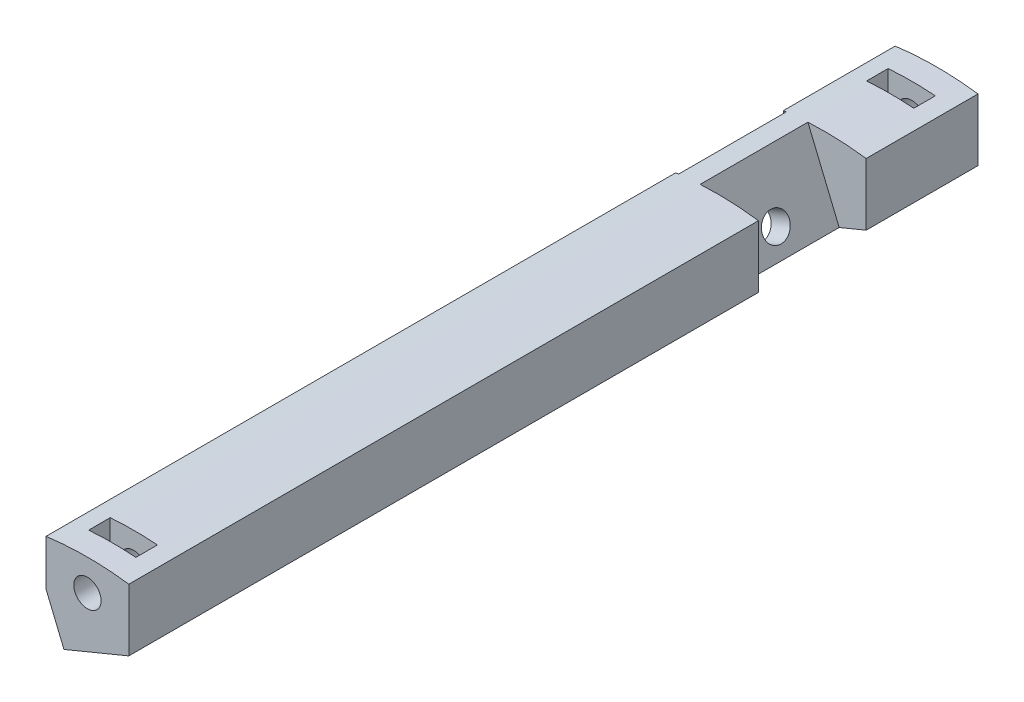
ISO-10303-21;
HEADER;
FILE_DESCRIPTION(('STEP AP214'),'2;1');
FILE_NAME('part.step','',(''),(''),'','','');
FILE_SCHEMA(('AUTOMOTIVE_DESIGN { 1 0 10303 214 1 1 1 1 }'));
ENDSEC;
DATA;
#1=APPLICATION_CONTEXT('core data for automotive mechanical design processes');
#2=APPLICATION_PROTOCOL_DEFINITION('international standard','automotive_design',2000,#1);
#3=PRODUCT_CONTEXT('',#1,'mechanical');
#4=PRODUCT('Part','Part','',(#3));
#5=PRODUCT_RELATED_PRODUCT_CATEGORY('part','',(#4));
#6=PRODUCT_DEFINITION_FORMATION('','',#4);
#7=PRODUCT_DEFINITION_CONTEXT('part definition',#1,'design');
#8=PRODUCT_DEFINITION('design','',#6,#7);
#9=PRODUCT_DEFINITION_SHAPE('','',#8);
#10=(LENGTH_UNIT() NAMED_UNIT(*) SI_UNIT(.MILLI.,.METRE.));
#11=(NAMED_UNIT(*) PLANE_ANGLE_UNIT() SI_UNIT($,.RADIAN.));
#12=(NAMED_UNIT(*) SI_UNIT($,.STERADIAN.) SOLID_ANGLE_UNIT());
#13=UNCERTAINTY_MEASURE_WITH_UNIT(LENGTH_MEASURE(1.E-05),#10,'distance_accuracy_value','');
#14=(GEOMETRIC_REPRESENTATION_CONTEXT(3) GLOBAL_UNCERTAINTY_ASSIGNED_CONTEXT((#13)) GLOBAL_UNIT_ASSIGNED_CONTEXT((#10,
#11,#12)) REPRESENTATION_CONTEXT('',''));
#15=CARTESIAN_POINT('',(0.,0.,0.));
#16=DIRECTION('',(0.,0.,1.));
#17=DIRECTION('',(1.,0.,0.));
#18=AXIS2_PLACEMENT_3D('',#15,#16,#17);
#19=CARTESIAN_POINT('',(0.,0.,102.5));
#20=DIRECTION('',(0.,0.,-1.));
#21=DIRECTION('',(-1.,0.,0.));
#22=AXIS2_PLACEMENT_3D('',#19,#20,#21);
#23=CYLINDRICAL_SURFACE('',#22,37.5);
#24=DIRECTION('',(0.,0.,-1.));
#25=VECTOR('',#24,1.);
#26=CARTESIAN_POINT('',(2.85,37.3915431615225,5.6));
#27=LINE('',#26,#25);
#28=CARTESIAN_POINT('',(2.85,37.3915431615225,5.6));
#29=VERTEX_POINT('',#28);
#30=CARTESIAN_POINT('',(2.85,37.3915431615225,3.));
#31=VERTEX_POINT('',#30);
#32=EDGE_CURVE('E373',#29,#31,#27,.T.);
#33=ORIENTED_EDGE('',*,*,#32,.F.);
#34=CARTESIAN_POINT('',(0.,0.,5.6));
#35=DIRECTION('',(0.,0.,-1.));
#36=DIRECTION('',(-1.,0.,0.));
#37=AXIS2_PLACEMENT_3D('',#34,#35,#36);
#38=CIRCLE('',#37,37.5);
#39=CARTESIAN_POINT('',(-2.85,37.3915431615225,5.6));
#40=VERTEX_POINT('',#39);
#41=EDGE_CURVE('E357',#40,#29,#38,.T.);
#42=ORIENTED_EDGE('',*,*,#41,.F.);
#43=DIRECTION('',(0.,0.,-1.));
#44=VECTOR('',#43,1.);
#45=CARTESIAN_POINT('',(-2.85,37.3915431615225,5.6));
#46=LINE('',#45,#44);
#47=CARTESIAN_POINT('',(-2.85,37.3915431615225,3.));
#48=VERTEX_POINT('',#47);
#49=EDGE_CURVE('E387',#40,#48,#46,.T.);
#50=ORIENTED_EDGE('',*,*,#49,.T.);
#51=CARTESIAN_POINT('',(0.,0.,3.));
#52=DIRECTION('',(0.,0.,-1.));
#53=DIRECTION('',(-1.,0.,0.));
#54=AXIS2_PLACEMENT_3D('',#51,#52,#53);
#55=CIRCLE('',#54,37.5);
#56=EDGE_CURVE('E352',#48,#31,#55,.T.);
#57=ORIENTED_EDGE('',*,*,#56,.T.);
#58=EDGE_LOOP('',(#33,#42,#50,#57));
#59=FACE_BOUND('',#58,.T.);
#60=DIRECTION('',(0.,0.,-1.));
#61=VECTOR('',#60,1.);
#62=CARTESIAN_POINT('',(-5.,37.1651718682963,102.5));
#63=LINE('',#62,#61);
#64=CARTESIAN_POINT('',(-5.,37.1651718682963,13.5));
#65=VERTEX_POINT('',#64);
#66=CARTESIAN_POINT('',(-5.,37.1651718682963,0.));
#67=VERTEX_POINT('',#66);
#68=EDGE_CURVE('E452',#65,#67,#63,.T.);
#69=ORIENTED_EDGE('',*,*,#68,.F.);
#70=CARTESIAN_POINT('',(0.,0.,13.5));
#71=DIRECTION('',(0.,0.,1.));
#72=DIRECTION('',(1.,0.,0.));
#73=AXIS2_PLACEMENT_3D('',#70,#71,#72);
#74=CIRCLE('',#73,37.5);
#75=CARTESIAN_POINT('',(-4.64277954221572,37.2114847610571,13.5));
#76=VERTEX_POINT('',#75);
#77=EDGE_CURVE('E303',#76,#65,#74,.T.);
#78=ORIENTED_EDGE('',*,*,#77,.F.);
#79=DIRECTION('',(0.,0.,1.));
#80=VECTOR('',#79,1.);
#81=CARTESIAN_POINT('',(-4.64277954221572,37.2114847610571,13.5));
#82=LINE('',#81,#80);
#83=CARTESIAN_POINT('',(-4.64277954221572,37.2114847610571,26.5));
#84=VERTEX_POINT('',#83);
#85=EDGE_CURVE('E311',#76,#84,#82,.T.);
#86=ORIENTED_EDGE('',*,*,#85,.T.);
#87=CARTESIAN_POINT('',(0.,0.,26.5));
#88=DIRECTION('',(0.,0.,1.));
#89=DIRECTION('',(1.,0.,0.));
#90=AXIS2_PLACEMENT_3D('',#87,#88,#89);
#91=CIRCLE('',#90,37.5);
#92=CARTESIAN_POINT('',(-5.,37.1651718682963,26.5));
#93=VERTEX_POINT('',#92);
#94=EDGE_CURVE('E314',#84,#93,#91,.T.);
#95=ORIENTED_EDGE('',*,*,#94,.T.);
#96=CARTESIAN_POINT('',(-5.,37.1651718682963,102.5));
#97=VERTEX_POINT('',#96);
#98=EDGE_CURVE('E453',#97,#93,#63,.T.);
#99=ORIENTED_EDGE('',*,*,#98,.F.);
#100=CARTESIAN_POINT('',(0.,0.,102.5));
#101=DIRECTION('',(0.,0.,1.));
#102=DIRECTION('',(1.,0.,0.));
#103=AXIS2_PLACEMENT_3D('',#100,#101,#102);
#104=CIRCLE('',#103,37.5);
#105=CARTESIAN_POINT('',(5.,37.1651718682963,102.5));
#106=VERTEX_POINT('',#105);
#107=EDGE_CURVE('E407',#97,#106,#104,.F.);
#108=ORIENTED_EDGE('',*,*,#107,.T.);
#109=DIRECTION('',(0.,0.,-1.));
#110=VECTOR('',#109,1.);
#111=CARTESIAN_POINT('',(5.,37.1651718682963,102.5));
#112=LINE('',#111,#110);
#113=CARTESIAN_POINT('',(5.,37.1651718682963,26.5));
#114=VERTEX_POINT('',#113);
#115=EDGE_CURVE('E437',#106,#114,#112,.T.);
#116=ORIENTED_EDGE('',*,*,#115,.T.);
#117=CARTESIAN_POINT('',(0.,0.,26.5));
#118=DIRECTION('',(0.,0.,1.));
#119=DIRECTION('',(1.,0.,0.));
#120=AXIS2_PLACEMENT_3D('',#117,#118,#119);
#121=CIRCLE('',#120,37.5);
#122=CARTESIAN_POINT('',(-2.03345257029292,37.444827021157,26.5));
#123=VERTEX_POINT('',#122);
#124=EDGE_CURVE('E328',#114,#123,#121,.T.);
#125=ORIENTED_EDGE('',*,*,#124,.T.);
#126=DIRECTION('',(0.,0.,1.));
#127=VECTOR('',#126,1.);
#128=CARTESIAN_POINT('',(-2.03345257029292,37.444827021157,13.5));
#129=LINE('',#128,#127);
#130=CARTESIAN_POINT('',(-2.03345257029292,37.444827021157,13.5));
#131=VERTEX_POINT('',#130);
#132=EDGE_CURVE('E350',#131,#123,#129,.T.);
#133=ORIENTED_EDGE('',*,*,#132,.F.);
#134=CARTESIAN_POINT('',(0.,0.,13.5));
#135=DIRECTION('',(0.,0.,1.));
#136=DIRECTION('',(1.,0.,0.));
#137=AXIS2_PLACEMENT_3D('',#134,#135,#136);
#138=CIRCLE('',#137,37.5);
#139=CARTESIAN_POINT('',(5.,37.1651718682963,13.5));
#140=VERTEX_POINT('',#139);
#141=EDGE_CURVE('E334',#140,#131,#138,.T.);
#142=ORIENTED_EDGE('',*,*,#141,.F.);
#143=CARTESIAN_POINT('',(5.,37.1651718682963,0.));
#144=VERTEX_POINT('',#143);
#145=EDGE_CURVE('E423',#140,#144,#112,.T.);
#146=ORIENTED_EDGE('',*,*,#145,.T.);
#147=CARTESIAN_POINT('',(0.,0.,0.));
#148=DIRECTION('',(0.,0.,1.));
#149=DIRECTION('',(1.,0.,0.));
#150=AXIS2_PLACEMENT_3D('',#147,#148,#149);
#151=CIRCLE('',#150,37.5);
#152=EDGE_CURVE('E402',#67,#144,#151,.F.);
#153=ORIENTED_EDGE('',*,*,#152,.F.);
#154=EDGE_LOOP('',(#69,#78,#86,#95,#99,#108,#116,#125,#133,#142,#146,#153));
#155=FACE_BOUND('',#154,.T.);
#156=DIRECTION('',(0.,0.,1.));
#157=VECTOR('',#156,1.);
#158=CARTESIAN_POINT('',(-2.85,37.3915431615225,96.9));
#159=LINE('',#158,#157);
#160=CARTESIAN_POINT('',(-2.85,37.3915431615225,96.9));
#161=VERTEX_POINT('',#160);
#162=CARTESIAN_POINT('',(-2.85,37.3915431615225,99.5));
#163=VERTEX_POINT('',#162);
#164=EDGE_CURVE('E263',#161,#163,#159,.T.);
#165=ORIENTED_EDGE('',*,*,#164,.F.);
#166=CARTESIAN_POINT('',(0.,0.,96.9));
#167=DIRECTION('',(0.,0.,1.));
#168=DIRECTION('',(1.,0.,0.));
#169=AXIS2_PLACEMENT_3D('',#166,#167,#168);
#170=CIRCLE('',#169,37.5);
#171=CARTESIAN_POINT('',(2.85,37.3915431615225,96.9));
#172=VERTEX_POINT('',#171);
#173=EDGE_CURVE('E270',#172,#161,#170,.T.);
#174=ORIENTED_EDGE('',*,*,#173,.F.);
#175=DIRECTION('',(0.,0.,1.));
#176=VECTOR('',#175,1.);
#177=CARTESIAN_POINT('',(2.85,37.3915431615225,96.9));
#178=LINE('',#177,#176);
#179=CARTESIAN_POINT('',(2.85,37.3915431615225,99.5));
#180=VERTEX_POINT('',#179);
#181=EDGE_CURVE('E481',#172,#180,#178,.T.);
#182=ORIENTED_EDGE('',*,*,#181,.T.);
#183=CARTESIAN_POINT('',(0.,0.,99.5));
#184=DIRECTION('',(0.,0.,1.));
#185=DIRECTION('',(1.,0.,0.));
#186=AXIS2_PLACEMENT_3D('',#183,#184,#185);
#187=CIRCLE('',#186,37.5);
#188=EDGE_CURVE('E283',#180,#163,#187,.T.);
#189=ORIENTED_EDGE('',*,*,#188,.T.);
#190=EDGE_LOOP('',(#165,#174,#182,#189));
#191=FACE_BOUND('',#190,.T.);
#192=ADVANCED_FACE('F77',(#59,#155,#191),#23,.T.);
#193=CARTESIAN_POINT('',(-9.74398788114535,23.5705545307802,102.5));
#194=DIRECTION('',(0.382038938739746,-0.924146227220892,0.));
#195=DIRECTION('',(0.924146227220892,0.382038938739746,0.));
#196=AXIS2_PLACEMENT_3D('',#193,#194,#195);
#197=PLANE('',#196);
#198=DIRECTION('',(0.924146227220892,0.382038938739746,0.));
#199=VECTOR('',#198,1.);
#200=CARTESIAN_POINT('',(-9.74398788114535,23.5705545307802,13.5));
#201=LINE('',#200,#199);
#202=CARTESIAN_POINT('',(-0.564385746059894,27.3653711457734,13.5));
#203=VERTEX_POINT('',#202);
#204=CARTESIAN_POINT('',(5.,29.6656694779498,13.5));
#205=VERTEX_POINT('',#204);
#206=EDGE_CURVE('E330',#203,#205,#201,.T.);
#207=ORIENTED_EDGE('',*,*,#206,.F.);
#208=DIRECTION('',(0.,0.,-1.));
#209=VECTOR('',#208,1.);
#210=CARTESIAN_POINT('',(-0.564385746093131,27.3653711457597,13.5));
#211=LINE('',#210,#209);
#212=CARTESIAN_POINT('',(-0.564385746093132,27.3653711457597,11.));
#213=VERTEX_POINT('',#212);
#214=EDGE_CURVE('E102',#203,#213,#211,.T.);
#215=ORIENTED_EDGE('',*,*,#214,.T.);
#216=DIRECTION('',(-0.924146227220892,-0.382038938739746,0.));
#217=VECTOR('',#216,1.);
#218=CARTESIAN_POINT('',(-9.74398788114535,23.5705545307802,11.));
#219=LINE('',#218,#217);
#220=CARTESIAN_POINT('',(-2.83353083101524,26.4273142078472,11.));
#221=VERTEX_POINT('',#220);
#222=EDGE_CURVE('E474',#213,#221,#219,.T.);
#223=ORIENTED_EDGE('',*,*,#222,.T.);
#224=DIRECTION('',(0.,0.,-1.));
#225=VECTOR('',#224,1.);
#226=CARTESIAN_POINT('',(-2.83353083101524,26.4273142078472,102.5));
#227=LINE('',#226,#225);
#228=CARTESIAN_POINT('',(-2.83353083101524,26.4273142078472,0.));
#229=VERTEX_POINT('',#228);
#230=EDGE_CURVE('E444',#221,#229,#227,.T.);
#231=ORIENTED_EDGE('',*,*,#230,.T.);
#232=DIRECTION('',(-0.924146227220892,-0.382038938739746,0.));
#233=VECTOR('',#232,1.);
#234=CARTESIAN_POINT('',(-9.74398788114535,23.5705545307802,0.));
#235=LINE('',#234,#233);
#236=CARTESIAN_POINT('',(5.,29.6656694779498,0.));
#237=VERTEX_POINT('',#236);
#238=EDGE_CURVE('E432',#237,#229,#235,.T.);
#239=ORIENTED_EDGE('',*,*,#238,.F.);
#240=DIRECTION('',(0.,0.,-1.));
#241=VECTOR('',#240,1.);
#242=CARTESIAN_POINT('',(5.,29.6656694779498,102.5));
#243=LINE('',#242,#241);
#244=EDGE_CURVE('E440',#205,#237,#243,.T.);
#245=ORIENTED_EDGE('',*,*,#244,.F.);
#246=EDGE_LOOP('',(#207,#215,#223,#231,#239,#245));
#247=FACE_BOUND('',#246,.T.);
#248=ADVANCED_FACE('F520',(#247),#197,.T.);
#249=CARTESIAN_POINT('',(-5.,0.,102.5));
#250=DIRECTION('',(-1.,0.,0.));
#251=DIRECTION('',(0.,0.,1.));
#252=AXIS2_PLACEMENT_3D('',#249,#250,#251);
#253=PLANE('',#252);
#254=DIRECTION('',(0.,0.,-1.));
#255=VECTOR('',#254,1.);
#256=CARTESIAN_POINT('',(-5.,31.6576334580734,102.5));
#257=LINE('',#256,#255);
#258=CARTESIAN_POINT('',(-5.,31.6576334580734,13.5));
#259=VERTEX_POINT('',#258);
#260=CARTESIAN_POINT('',(-5.,31.6576334580734,0.));
#261=VERTEX_POINT('',#260);
#262=EDGE_CURVE('E448',#259,#261,#257,.T.);
#263=ORIENTED_EDGE('',*,*,#262,.F.);
#264=DIRECTION('',(0.,-1.,0.));
#265=VECTOR('',#264,1.);
#266=CARTESIAN_POINT('',(-5.,0.,13.5));
#267=LINE('',#266,#265);
#268=EDGE_CURVE('E306',#65,#259,#267,.T.);
#269=ORIENTED_EDGE('',*,*,#268,.F.);
#270=ORIENTED_EDGE('',*,*,#68,.T.);
#271=DIRECTION('',(0.,1.,0.));
#272=VECTOR('',#271,1.);
#273=CARTESIAN_POINT('',(-5.,0.,0.));
#274=LINE('',#273,#272);
#275=EDGE_CURVE('E426',#261,#67,#274,.T.);
#276=ORIENTED_EDGE('',*,*,#275,.F.);
#277=EDGE_LOOP('',(#263,#269,#270,#276));
#278=FACE_BOUND('',#277,.T.);
#279=ADVANCED_FACE('F528',(#278),#253,.T.);
#280=CARTESIAN_POINT('',(6.92489669429458,2.86838612880943,102.5));
#281=DIRECTION('',(-0.923879532511286,-0.382683432365091,0.));
#282=DIRECTION('',(0.382683432365091,-0.923879532511287,0.));
#283=AXIS2_PLACEMENT_3D('',#280,#281,#282);
#284=PLANE('',#283);
#285=ORIENTED_EDGE('',*,*,#230,.F.);
#286=DIRECTION('',(0.27059808298446,-0.653281561893243,-0.707106695185005));
#287=VECTOR('',#286,1.);
#288=CARTESIAN_POINT('',(-15.4620829121985,56.9153359153747,43.999988871355));
#289=LINE('',#288,#287);
#290=CARTESIAN_POINT('',(-3.79023964464647,28.7370136009576,13.5));
#291=VERTEX_POINT('',#290);
#292=EDGE_CURVE('E477',#221,#291,#289,.F.);
#293=ORIENTED_EDGE('',*,*,#292,.T.);
#294=DIRECTION('',(0.382683432365091,-0.923879532511286,0.));
#295=VECTOR('',#294,1.);
#296=CARTESIAN_POINT('',(6.92489669429458,2.86838612880943,13.5));
#297=LINE('',#296,#295);
#298=EDGE_CURVE('E308',#259,#291,#297,.T.);
#299=ORIENTED_EDGE('',*,*,#298,.F.);
#300=ORIENTED_EDGE('',*,*,#262,.T.);
#301=DIRECTION('',(-0.382683432365091,0.923879532511286,0.));
#302=VECTOR('',#301,1.);
#303=CARTESIAN_POINT('',(6.92489669429458,2.86838612880943,0.));
#304=LINE('',#303,#302);
#305=EDGE_CURVE('E429',#229,#261,#304,.T.);
#306=ORIENTED_EDGE('',*,*,#305,.F.);
#307=EDGE_LOOP('',(#285,#293,#299,#300,#306));
#308=FACE_BOUND('',#307,.T.);
#309=ADVANCED_FACE('F615',(#308),#284,.T.);
#310=CARTESIAN_POINT('',(-2.83353083101524,26.4273142078472,102.5));
#311=VERTEX_POINT('',#310);
#312=CARTESIAN_POINT('',(-2.83353083101524,26.4273142078472,29.));
#313=VERTEX_POINT('',#312);
#314=EDGE_CURVE('E445',#311,#313,#227,.T.);
#315=ORIENTED_EDGE('',*,*,#314,.T.);
#316=DIRECTION('',(0.924146227220892,0.382038938739746,0.));
#317=VECTOR('',#316,1.);
#318=CARTESIAN_POINT('',(-0.564385746059894,27.3653711457734,29.));
#319=LINE('',#318,#317);
#320=CARTESIAN_POINT('',(-0.564385746093132,27.3653711457597,29.));
#321=VERTEX_POINT('',#320);
#322=EDGE_CURVE('E464',#313,#321,#319,.T.);
#323=ORIENTED_EDGE('',*,*,#322,.T.);
#324=DIRECTION('',(0.,0.,-1.));
#325=VECTOR('',#324,1.);
#326=CARTESIAN_POINT('',(-0.564385746093131,27.3653711457597,13.5));
#327=LINE('',#326,#325);
#328=CARTESIAN_POINT('',(-0.564385746059894,27.3653711457734,26.5));
#329=VERTEX_POINT('',#328);
#330=EDGE_CURVE('E456',#321,#329,#327,.T.);
#331=ORIENTED_EDGE('',*,*,#330,.T.);
#332=DIRECTION('',(0.924146227220892,0.382038938739746,0.));
#333=VECTOR('',#332,1.);
#334=CARTESIAN_POINT('',(-9.74398788114535,23.5705545307802,26.5));
#335=LINE('',#334,#333);
#336=CARTESIAN_POINT('',(5.,29.6656694779498,26.5));
#337=VERTEX_POINT('',#336);
#338=EDGE_CURVE('E342',#329,#337,#335,.T.);
#339=ORIENTED_EDGE('',*,*,#338,.T.);
#340=CARTESIAN_POINT('',(5.,29.6656694779498,102.5));
#341=VERTEX_POINT('',#340);
#342=EDGE_CURVE('E441',#341,#337,#243,.T.);
#343=ORIENTED_EDGE('',*,*,#342,.F.);
#344=DIRECTION('',(-0.924146227220892,-0.382038938739746,0.));
#345=VECTOR('',#344,1.);
#346=CARTESIAN_POINT('',(-9.74398788114535,23.5705545307802,102.5));
#347=LINE('',#346,#345);
#348=EDGE_CURVE('E417',#341,#311,#347,.T.);
#349=ORIENTED_EDGE('',*,*,#348,.T.);
#350=EDGE_LOOP('',(#315,#323,#331,#339,#343,#349));
#351=FACE_BOUND('',#350,.T.);
#352=ADVANCED_FACE('F531',(#351),#197,.T.);
#353=CARTESIAN_POINT('',(5.,0.,102.5));
#354=DIRECTION('',(1.,0.,0.));
#355=DIRECTION('',(0.,1.,0.));
#356=AXIS2_PLACEMENT_3D('',#353,#354,#355);
#357=PLANE('',#356);
#358=ORIENTED_EDGE('',*,*,#145,.F.);
#359=DIRECTION('',(0.,1.,0.));
#360=VECTOR('',#359,1.);
#361=CARTESIAN_POINT('',(5.,0.,13.5));
#362=LINE('',#361,#360);
#363=EDGE_CURVE('E332',#205,#140,#362,.T.);
#364=ORIENTED_EDGE('',*,*,#363,.F.);
#365=ORIENTED_EDGE('',*,*,#244,.T.);
#366=DIRECTION('',(0.,-1.,0.));
#367=VECTOR('',#366,1.);
#368=CARTESIAN_POINT('',(5.,0.,0.));
#369=LINE('',#368,#367);
#370=EDGE_CURVE('E411',#144,#237,#369,.T.);
#371=ORIENTED_EDGE('',*,*,#370,.F.);
#372=EDGE_LOOP('',(#358,#364,#365,#371));
#373=FACE_BOUND('',#372,.T.);
#374=ADVANCED_FACE('F598',(#373),#357,.T.);
#375=DIRECTION('',(0.,-1.,0.));
#376=VECTOR('',#375,1.);
#377=CARTESIAN_POINT('',(-5.,0.,26.5));
#378=LINE('',#377,#376);
#379=CARTESIAN_POINT('',(-5.,31.6576334580734,26.5));
#380=VERTEX_POINT('',#379);
#381=EDGE_CURVE('E317',#93,#380,#378,.T.);
#382=ORIENTED_EDGE('',*,*,#381,.T.);
#383=CARTESIAN_POINT('',(-5.,31.6576334580734,102.5));
#384=VERTEX_POINT('',#383);
#385=EDGE_CURVE('E449',#384,#380,#257,.T.);
#386=ORIENTED_EDGE('',*,*,#385,.F.);
#387=DIRECTION('',(0.,1.,0.));
#388=VECTOR('',#387,1.);
#389=CARTESIAN_POINT('',(-5.,0.,102.5));
#390=LINE('',#389,#388);
#391=EDGE_CURVE('E410',#384,#97,#390,.T.);
#392=ORIENTED_EDGE('',*,*,#391,.T.);
#393=ORIENTED_EDGE('',*,*,#98,.T.);
#394=EDGE_LOOP('',(#382,#386,#392,#393));
#395=FACE_BOUND('',#394,.T.);
#396=ADVANCED_FACE('F535',(#395),#253,.T.);
#397=DIRECTION('',(0.382683432365091,-0.923879532511286,0.));
#398=VECTOR('',#397,1.);
#399=CARTESIAN_POINT('',(6.92489669429458,2.86838612880943,26.5));
#400=LINE('',#399,#398);
#401=CARTESIAN_POINT('',(-3.79023964464648,28.7370136009576,26.5));
#402=VERTEX_POINT('',#401);
#403=EDGE_CURVE('E304',#380,#402,#400,.T.);
#404=ORIENTED_EDGE('',*,*,#403,.T.);
#405=DIRECTION('',(0.270598082984461,-0.653281561893244,0.707106695185004));
#406=VECTOR('',#405,1.);
#407=CARTESIAN_POINT('',(16.1093002579206,-19.3047255168043,78.4999910605958));
#408=LINE('',#407,#406);
#409=EDGE_CURVE('E469',#402,#313,#408,.T.);
#410=ORIENTED_EDGE('',*,*,#409,.T.);
#411=ORIENTED_EDGE('',*,*,#314,.F.);
#412=DIRECTION('',(-0.382683432365091,0.923879532511286,0.));
#413=VECTOR('',#412,1.);
#414=CARTESIAN_POINT('',(6.92489669429458,2.86838612880943,102.5));
#415=LINE('',#414,#413);
#416=EDGE_CURVE('E414',#311,#384,#415,.T.);
#417=ORIENTED_EDGE('',*,*,#416,.T.);
#418=ORIENTED_EDGE('',*,*,#385,.T.);
#419=EDGE_LOOP('',(#404,#410,#411,#417,#418));
#420=FACE_BOUND('',#419,.T.);
#421=ADVANCED_FACE('F558',(#420),#284,.T.);
#422=DIRECTION('',(0.,1.,0.));
#423=VECTOR('',#422,1.);
#424=CARTESIAN_POINT('',(5.,0.,26.5));
#425=LINE('',#424,#423);
#426=EDGE_CURVE('E345',#337,#114,#425,.T.);
#427=ORIENTED_EDGE('',*,*,#426,.T.);
#428=ORIENTED_EDGE('',*,*,#115,.F.);
#429=DIRECTION('',(0.,-1.,0.));
#430=VECTOR('',#429,1.);
#431=CARTESIAN_POINT('',(5.,0.,102.5));
#432=LINE('',#431,#430);
#433=EDGE_CURVE('E420',#106,#341,#432,.T.);
#434=ORIENTED_EDGE('',*,*,#433,.T.);
#435=ORIENTED_EDGE('',*,*,#342,.T.);
#436=EDGE_LOOP('',(#427,#428,#434,#435));
#437=FACE_BOUND('',#436,.T.);
#438=ADVANCED_FACE('F568',(#437),#357,.T.);
#439=CARTESIAN_POINT('',(0.,0.,102.5));
#440=DIRECTION('',(0.,0.,1.));
#441=DIRECTION('',(1.,0.,0.));
#442=AXIS2_PLACEMENT_3D('',#439,#440,#441);
#443=PLANE('',#442);
#444=CARTESIAN_POINT('',(0.,33.75,102.5));
#445=DIRECTION('',(0.,0.,1.));
#446=DIRECTION('',(1.,0.,0.));
#447=AXIS2_PLACEMENT_3D('',#444,#445,#446);
#448=CIRCLE('',#447,1.65);
#449=CARTESIAN_POINT('',(1.65,33.75,102.5));
#450=VERTEX_POINT('',#449);
#451=EDGE_CURVE('E295',#450,#450,#448,.T.);
#452=ORIENTED_EDGE('',*,*,#451,.F.);
#453=EDGE_LOOP('',(#452));
#454=FACE_BOUND('',#453,.T.);
#455=ORIENTED_EDGE('',*,*,#107,.F.);
#456=ORIENTED_EDGE('',*,*,#391,.F.);
#457=ORIENTED_EDGE('',*,*,#416,.F.);
#458=ORIENTED_EDGE('',*,*,#348,.F.);
#459=ORIENTED_EDGE('',*,*,#433,.F.);
#460=EDGE_LOOP('',(#455,#456,#457,#458,#459));
#461=FACE_BOUND('',#460,.T.);
#462=ADVANCED_FACE('F565',(#454,#461),#443,.T.);
#463=CARTESIAN_POINT('',(0.,0.,0.));
#464=DIRECTION('',(0.,0.,1.));
#465=DIRECTION('',(1.,0.,0.));
#466=AXIS2_PLACEMENT_3D('',#463,#464,#465);
#467=PLANE('',#466);
#468=CARTESIAN_POINT('',(0.,33.75,0.));
#469=DIRECTION('',(0.,0.,-1.));
#470=DIRECTION('',(-1.,0.,0.));
#471=AXIS2_PLACEMENT_3D('',#468,#469,#470);
#472=CIRCLE('',#471,1.75);
#473=CARTESIAN_POINT('',(-1.75,33.75,0.));
#474=VERTEX_POINT('',#473);
#475=EDGE_CURVE('E403',#474,#474,#472,.T.);
#476=ORIENTED_EDGE('',*,*,#475,.F.);
#477=EDGE_LOOP('',(#476));
#478=FACE_BOUND('',#477,.T.);
#479=ORIENTED_EDGE('',*,*,#152,.T.);
#480=ORIENTED_EDGE('',*,*,#370,.T.);
#481=ORIENTED_EDGE('',*,*,#238,.T.);
#482=ORIENTED_EDGE('',*,*,#305,.T.);
#483=ORIENTED_EDGE('',*,*,#275,.T.);
#484=EDGE_LOOP('',(#479,#480,#481,#482,#483));
#485=FACE_BOUND('',#484,.T.);
#486=ADVANCED_FACE('F604',(#478,#485),#467,.F.);
#487=CARTESIAN_POINT('',(0.,33.75,11.5));
#488=DIRECTION('',(0.,0.,-1.));
#489=DIRECTION('',(-1.,0.,0.));
#490=AXIS2_PLACEMENT_3D('',#487,#488,#489);
#491=CYLINDRICAL_SURFACE('',#490,1.75);
#492=CARTESIAN_POINT('',(0.,33.75,3.));
#493=DIRECTION('',(0.,0.,-1.));
#494=DIRECTION('',(-1.,0.,0.));
#495=AXIS2_PLACEMENT_3D('',#492,#493,#494);
#496=CIRCLE('',#495,1.75);
#497=CARTESIAN_POINT('',(-1.75,33.75,3.));
#498=VERTEX_POINT('',#497);
#499=EDGE_CURVE('E390',#498,#498,#496,.F.);
#500=ORIENTED_EDGE('',*,*,#499,.T.);
#501=EDGE_LOOP('',(#500));
#502=FACE_BOUND('',#501,.T.);
#503=ORIENTED_EDGE('',*,*,#475,.T.);
#504=EDGE_LOOP('',(#503));
#505=FACE_BOUND('',#504,.T.);
#506=ADVANCED_FACE('F638',(#502,#505),#491,.F.);
#507=CARTESIAN_POINT('',(0.,0.,5.6));
#508=DIRECTION('',(0.,0.,-1.));
#509=DIRECTION('',(-1.,0.,0.));
#510=AXIS2_PLACEMENT_3D('',#507,#508,#509);
#511=PLANE('',#510);
#512=ORIENTED_EDGE('',*,*,#41,.T.);
#513=DIRECTION('',(0.,-1.,0.));
#514=VECTOR('',#513,1.);
#515=CARTESIAN_POINT('',(2.85,37.3915431615225,5.6));
#516=LINE('',#515,#514);
#517=CARTESIAN_POINT('',(2.85,31.9954482671904,5.6));
#518=VERTEX_POINT('',#517);
#519=EDGE_CURVE('E360',#29,#518,#516,.T.);
#520=ORIENTED_EDGE('',*,*,#519,.T.);
#521=DIRECTION('',(-0.866025403784438,-0.500000000000001,0.));
#522=VECTOR('',#521,1.);
#523=CARTESIAN_POINT('',(2.85,31.9954482671904,5.6));
#524=LINE('',#523,#522);
#525=CARTESIAN_POINT('',(0.,30.35,5.6));
#526=VERTEX_POINT('',#525);
#527=EDGE_CURVE('E364',#518,#526,#524,.T.);
#528=ORIENTED_EDGE('',*,*,#527,.T.);
#529=DIRECTION('',(-0.866025403784438,0.500000000000001,0.));
#530=VECTOR('',#529,1.);
#531=CARTESIAN_POINT('',(0.,30.35,5.6));
#532=LINE('',#531,#530);
#533=CARTESIAN_POINT('',(-2.85,31.9954482671904,5.6));
#534=VERTEX_POINT('',#533);
#535=EDGE_CURVE('E367',#526,#534,#532,.T.);
#536=ORIENTED_EDGE('',*,*,#535,.T.);
#537=DIRECTION('',(0.,1.,0.));
#538=VECTOR('',#537,1.);
#539=CARTESIAN_POINT('',(-2.85,31.9954482671904,5.6));
#540=LINE('',#539,#538);
#541=EDGE_CURVE('E370',#534,#40,#540,.T.);
#542=ORIENTED_EDGE('',*,*,#541,.T.);
#543=EDGE_LOOP('',(#512,#520,#528,#536,#542));
#544=FACE_BOUND('',#543,.T.);
#545=CARTESIAN_POINT('',(0.,33.75,5.6));
#546=DIRECTION('',(0.,0.,-1.));
#547=DIRECTION('',(-1.,0.,0.));
#548=AXIS2_PLACEMENT_3D('',#545,#546,#547);
#549=CIRCLE('',#548,1.75);
#550=CARTESIAN_POINT('',(-1.75,33.75,5.6));
#551=VERTEX_POINT('',#550);
#552=EDGE_CURVE('E406',#551,#551,#549,.F.);
#553=ORIENTED_EDGE('',*,*,#552,.T.);
#554=EDGE_LOOP('',(#553));
#555=FACE_BOUND('',#554,.T.);
#556=ADVANCED_FACE('F645',(#544,#555),#511,.T.);
#557=CARTESIAN_POINT('',(0.,0.,3.));
#558=DIRECTION('',(0.,0.,-1.));
#559=DIRECTION('',(-1.,0.,0.));
#560=AXIS2_PLACEMENT_3D('',#557,#558,#559);
#561=PLANE('',#560);
#562=ORIENTED_EDGE('',*,*,#56,.F.);
#563=DIRECTION('',(0.,1.,0.));
#564=VECTOR('',#563,1.);
#565=CARTESIAN_POINT('',(-2.85,31.9954482671904,3.));
#566=LINE('',#565,#564);
#567=CARTESIAN_POINT('',(-2.85,31.9954482671904,3.));
#568=VERTEX_POINT('',#567);
#569=EDGE_CURVE('E361',#568,#48,#566,.T.);
#570=ORIENTED_EDGE('',*,*,#569,.F.);
#571=DIRECTION('',(-0.866025403784438,0.500000000000001,0.));
#572=VECTOR('',#571,1.);
#573=CARTESIAN_POINT('',(0.,30.35,3.));
#574=LINE('',#573,#572);
#575=CARTESIAN_POINT('',(0.,30.35,3.));
#576=VERTEX_POINT('',#575);
#577=EDGE_CURVE('E382',#576,#568,#574,.T.);
#578=ORIENTED_EDGE('',*,*,#577,.F.);
#579=DIRECTION('',(-0.866025403784438,-0.500000000000001,0.));
#580=VECTOR('',#579,1.);
#581=CARTESIAN_POINT('',(2.85,31.9954482671904,3.));
#582=LINE('',#581,#580);
#583=CARTESIAN_POINT('',(2.85,31.9954482671904,3.));
#584=VERTEX_POINT('',#583);
#585=EDGE_CURVE('E379',#584,#576,#582,.T.);
#586=ORIENTED_EDGE('',*,*,#585,.F.);
#587=DIRECTION('',(0.,-1.,0.));
#588=VECTOR('',#587,1.);
#589=CARTESIAN_POINT('',(2.85,37.3915431615225,3.));
#590=LINE('',#589,#588);
#591=EDGE_CURVE('E376',#31,#584,#590,.T.);
#592=ORIENTED_EDGE('',*,*,#591,.F.);
#593=EDGE_LOOP('',(#562,#570,#578,#586,#592));
#594=FACE_BOUND('',#593,.T.);
#595=ORIENTED_EDGE('',*,*,#499,.F.);
#596=EDGE_LOOP('',(#595));
#597=FACE_BOUND('',#596,.T.);
#598=ADVANCED_FACE('F667',(#594,#597),#561,.F.);
#599=CARTESIAN_POINT('',(-2.85,31.9954482671904,5.6));
#600=DIRECTION('',(-1.,0.,0.));
#601=DIRECTION('',(0.,0.,1.));
#602=AXIS2_PLACEMENT_3D('',#599,#600,#601);
#603=PLANE('',#602);
#604=ORIENTED_EDGE('',*,*,#569,.T.);
#605=ORIENTED_EDGE('',*,*,#49,.F.);
#606=ORIENTED_EDGE('',*,*,#541,.F.);
#607=DIRECTION('',(0.,0.,-1.));
#608=VECTOR('',#607,1.);
#609=CARTESIAN_POINT('',(-2.85,31.9954482671904,5.6));
#610=LINE('',#609,#608);
#611=EDGE_CURVE('E391',#534,#568,#610,.T.);
#612=ORIENTED_EDGE('',*,*,#611,.T.);
#613=EDGE_LOOP('',(#604,#605,#606,#612));
#614=FACE_BOUND('',#613,.T.);
#615=ADVANCED_FACE('F663',(#614),#603,.F.);
#616=CARTESIAN_POINT('',(0.,30.35,5.6));
#617=DIRECTION('',(-0.500000000000001,-0.866025403784438,0.));
#618=DIRECTION('',(0.866025403784438,-0.500000000000001,0.));
#619=AXIS2_PLACEMENT_3D('',#616,#617,#618);
#620=PLANE('',#619);
#621=ORIENTED_EDGE('',*,*,#577,.T.);
#622=ORIENTED_EDGE('',*,*,#611,.F.);
#623=ORIENTED_EDGE('',*,*,#535,.F.);
#624=DIRECTION('',(0.,0.,-1.));
#625=VECTOR('',#624,1.);
#626=CARTESIAN_POINT('',(0.,30.35,5.6));
#627=LINE('',#626,#625);
#628=EDGE_CURVE('E393',#526,#576,#627,.T.);
#629=ORIENTED_EDGE('',*,*,#628,.T.);
#630=EDGE_LOOP('',(#621,#622,#623,#629));
#631=FACE_BOUND('',#630,.T.);
#632=ADVANCED_FACE('F659',(#631),#620,.F.);
#633=CARTESIAN_POINT('',(2.85,31.9954482671904,5.6));
#634=DIRECTION('',(0.500000000000001,-0.866025403784438,0.));
#635=DIRECTION('',(0.866025403784438,0.500000000000001,0.));
#636=AXIS2_PLACEMENT_3D('',#633,#634,#635);
#637=PLANE('',#636);
#638=ORIENTED_EDGE('',*,*,#585,.T.);
#639=ORIENTED_EDGE('',*,*,#628,.F.);
#640=ORIENTED_EDGE('',*,*,#527,.F.);
#641=DIRECTION('',(0.,0.,-1.));
#642=VECTOR('',#641,1.);
#643=CARTESIAN_POINT('',(2.85,31.9954482671904,5.6));
#644=LINE('',#643,#642);
#645=EDGE_CURVE('E395',#518,#584,#644,.T.);
#646=ORIENTED_EDGE('',*,*,#645,.T.);
#647=EDGE_LOOP('',(#638,#639,#640,#646));
#648=FACE_BOUND('',#647,.T.);
#649=ADVANCED_FACE('F655',(#648),#637,.F.);
#650=CARTESIAN_POINT('',(2.85,37.3915431615225,5.6));
#651=DIRECTION('',(1.,0.,0.));
#652=DIRECTION('',(0.,0.,-1.));
#653=AXIS2_PLACEMENT_3D('',#650,#651,#652);
#654=PLANE('',#653);
#655=ORIENTED_EDGE('',*,*,#591,.T.);
#656=ORIENTED_EDGE('',*,*,#645,.F.);
#657=ORIENTED_EDGE('',*,*,#519,.F.);
#658=ORIENTED_EDGE('',*,*,#32,.T.);
#659=EDGE_LOOP('',(#655,#656,#657,#658));
#660=FACE_BOUND('',#659,.T.);
#661=ADVANCED_FACE('F651',(#660),#654,.F.);
#662=CARTESIAN_POINT('',(0.,33.75,11.5));
#663=DIRECTION('',(0.,0.,-1.));
#664=DIRECTION('',(-1.,0.,0.));
#665=AXIS2_PLACEMENT_3D('',#662,#663,#664);
#666=PLANE('',#665);
#667=CARTESIAN_POINT('',(0.,33.75,11.5));
#668=DIRECTION('',(0.,0.,-1.));
#669=DIRECTION('',(-1.,0.,0.));
#670=AXIS2_PLACEMENT_3D('',#667,#668,#669);
#671=CIRCLE('',#670,1.75);
#672=CARTESIAN_POINT('',(-1.75,33.75,11.5));
#673=VERTEX_POINT('',#672);
#674=EDGE_CURVE('E399',#673,#673,#671,.T.);
#675=ORIENTED_EDGE('',*,*,#674,.T.);
#676=EDGE_LOOP('',(#675));
#677=FACE_BOUND('',#676,.T.);
#678=ADVANCED_FACE('F648',(#677),#666,.T.);
#679=ORIENTED_EDGE('',*,*,#674,.F.);
#680=EDGE_LOOP('',(#679));
#681=FACE_BOUND('',#680,.T.);
#682=ORIENTED_EDGE('',*,*,#552,.F.);
#683=EDGE_LOOP('',(#682));
#684=FACE_BOUND('',#683,.T.);
#685=ADVANCED_FACE('F647',(#681,#684),#491,.F.);
#686=CARTESIAN_POINT('',(11.5030852175246,4.76473390623218,13.5));
#687=DIRECTION('',(0.923879532511286,0.382683432365091,0.));
#688=DIRECTION('',(-0.382683432365091,0.923879532511286,0.));
#689=AXIS2_PLACEMENT_3D('',#686,#687,#688);
#690=PLANE('',#689);
#691=CARTESIAN_POINT('',(0.597930086858205,31.0921073224695,20.));
#692=DIRECTION('',(0.923879532511286,0.382683432365091,0.));
#693=DIRECTION('',(-0.382683432365091,0.923879532511286,0.));
#694=AXIS2_PLACEMENT_3D('',#691,#692,#693);
#695=CIRCLE('',#694,1.625);
#696=CARTESIAN_POINT('',(-0.0239304907350699,32.5934115628003,20.));
#697=VERTEX_POINT('',#696);
#698=EDGE_CURVE('E294',#697,#697,#695,.T.);
#699=ORIENTED_EDGE('',*,*,#698,.F.);
#700=EDGE_LOOP('',(#699));
#701=FACE_BOUND('',#700,.T.);
#702=DIRECTION('',(-0.382683432365091,0.923879532511286,0.));
#703=VECTOR('',#702,1.);
#704=CARTESIAN_POINT('',(11.5030852175246,4.76473390623218,26.5));
#705=LINE('',#704,#703);
#706=CARTESIAN_POINT('',(1.74578896431224,28.3209308528296,26.5));
#707=VERTEX_POINT('',#706);
#708=EDGE_CURVE('E324',#707,#123,#705,.T.);
#709=ORIENTED_EDGE('',*,*,#708,.F.);
#710=DIRECTION('',(0.,0.,1.));
#711=VECTOR('',#710,1.);
#712=CARTESIAN_POINT('',(1.74578896431224,28.3209308528296,13.5));
#713=LINE('',#712,#711);
#714=CARTESIAN_POINT('',(1.74578896431224,28.3209308528296,13.5));
#715=VERTEX_POINT('',#714);
#716=EDGE_CURVE('E337',#715,#707,#713,.T.);
#717=ORIENTED_EDGE('',*,*,#716,.F.);
#718=DIRECTION('',(-0.382683432365091,0.923879532511286,0.));
#719=VECTOR('',#718,1.);
#720=CARTESIAN_POINT('',(11.5030852175246,4.76473390623218,13.5));
#721=LINE('',#720,#719);
#722=EDGE_CURVE('E325',#715,#131,#721,.T.);
#723=ORIENTED_EDGE('',*,*,#722,.T.);
#724=ORIENTED_EDGE('',*,*,#132,.T.);
#725=EDGE_LOOP('',(#709,#717,#723,#724));
#726=FACE_BOUND('',#725,.T.);
#727=ADVANCED_FACE('F589',(#701,#726),#690,.T.);
#728=CARTESIAN_POINT('',(-9.74794388039498,23.5667674812199,13.5));
#729=DIRECTION('',(0.382223835543148,-0.9240697698457,0.));
#730=DIRECTION('',(0.9240697698457,0.382223835543148,0.));
#731=AXIS2_PLACEMENT_3D('',#728,#729,#730);
#732=PLANE('',#731);
#733=DIRECTION('',(0.9240697698457,0.382223835543148,0.));
#734=VECTOR('',#733,1.);
#735=CARTESIAN_POINT('',(-9.74794388039498,23.5667674812199,26.5));
#736=LINE('',#735,#734);
#737=EDGE_CURVE('E340',#329,#707,#736,.T.);
#738=ORIENTED_EDGE('',*,*,#737,.F.);
#739=DIRECTION('',(0.,0.,1.));
#740=VECTOR('',#739,1.);
#741=CARTESIAN_POINT('',(-0.564385746059894,27.3653711457734,13.5));
#742=LINE('',#741,#740);
#743=EDGE_CURVE('E353',#203,#329,#742,.T.);
#744=ORIENTED_EDGE('',*,*,#743,.F.);
#745=DIRECTION('',(0.9240697698457,0.382223835543148,0.));
#746=VECTOR('',#745,1.);
#747=CARTESIAN_POINT('',(-9.74794388039498,23.5667674812199,13.5));
#748=LINE('',#747,#746);
#749=EDGE_CURVE('E327',#203,#715,#748,.T.);
#750=ORIENTED_EDGE('',*,*,#749,.T.);
#751=ORIENTED_EDGE('',*,*,#716,.T.);
#752=EDGE_LOOP('',(#738,#744,#750,#751));
#753=FACE_BOUND('',#752,.T.);
#754=ADVANCED_FACE('F677',(#753),#732,.T.);
#755=CARTESIAN_POINT('',(0.,0.,13.5));
#756=DIRECTION('',(0.,0.,1.));
#757=DIRECTION('',(1.,0.,0.));
#758=AXIS2_PLACEMENT_3D('',#755,#756,#757);
#759=PLANE('',#758);
#760=ORIENTED_EDGE('',*,*,#722,.F.);
#761=ORIENTED_EDGE('',*,*,#749,.F.);
#762=ORIENTED_EDGE('',*,*,#206,.T.);
#763=ORIENTED_EDGE('',*,*,#363,.T.);
#764=ORIENTED_EDGE('',*,*,#141,.T.);
#765=EDGE_LOOP('',(#760,#761,#762,#763,#764));
#766=FACE_BOUND('',#765,.T.);
#767=ADVANCED_FACE('F594',(#766),#759,.T.);
#768=CARTESIAN_POINT('',(0.,0.,26.5));
#769=DIRECTION('',(0.,0.,1.));
#770=DIRECTION('',(1.,0.,0.));
#771=AXIS2_PLACEMENT_3D('',#768,#769,#770);
#772=PLANE('',#771);
#773=ORIENTED_EDGE('',*,*,#708,.T.);
#774=ORIENTED_EDGE('',*,*,#124,.F.);
#775=ORIENTED_EDGE('',*,*,#426,.F.);
#776=ORIENTED_EDGE('',*,*,#338,.F.);
#777=ORIENTED_EDGE('',*,*,#737,.T.);
#778=EDGE_LOOP('',(#773,#774,#775,#776,#777));
#779=FACE_BOUND('',#778,.T.);
#780=ADVANCED_FACE('F583',(#779),#772,.F.);
#781=CARTESIAN_POINT('',(9.19338638624639,3.80802532531944,13.5));
#782=DIRECTION('',(0.923879532511286,0.382683432365091,0.));
#783=DIRECTION('',(-0.382683432365091,0.923879532511286,0.));
#784=AXIS2_PLACEMENT_3D('',#781,#782,#783);
#785=PLANE('',#784);
#786=CARTESIAN_POINT('',(-1.71176874442002,30.1353987415567,20.));
#787=DIRECTION('',(0.923879532511286,0.382683432365091,0.));
#788=DIRECTION('',(-0.382683432365091,0.923879532511286,0.));
#789=AXIS2_PLACEMENT_3D('',#786,#787,#788);
#790=CIRCLE('',#789,1.625);
#791=CARTESIAN_POINT('',(-2.3336293220133,31.6367029818876,20.));
#792=VERTEX_POINT('',#791);
#793=EDGE_CURVE('E300',#792,#792,#790,.T.);
#794=ORIENTED_EDGE('',*,*,#793,.T.);
#795=EDGE_LOOP('',(#794));
#796=FACE_BOUND('',#795,.T.);
#797=ORIENTED_EDGE('',*,*,#743,.T.);
#798=ORIENTED_EDGE('',*,*,#330,.F.);
#799=DIRECTION('',(-0.270598082984461,0.653281561893244,-0.707106695185005));
#800=VECTOR('',#799,1.);
#801=CARTESIAN_POINT('',(1.34870490603182,22.7467617473504,33.9991455729976));
#802=LINE('',#801,#800);
#803=CARTESIAN_POINT('',(-1.52109455972437,29.6750705388701,26.5));
#804=VERTEX_POINT('',#803);
#805=EDGE_CURVE('E87',#321,#804,#802,.T.);
#806=ORIENTED_EDGE('',*,*,#805,.T.);
#807=DIRECTION('',(-0.382683432365091,0.923879532511286,0.));
#808=VECTOR('',#807,1.);
#809=CARTESIAN_POINT('',(9.19338638624639,3.80802532531944,26.5));
#810=LINE('',#809,#808);
#811=EDGE_CURVE('E312',#804,#84,#810,.T.);
#812=ORIENTED_EDGE('',*,*,#811,.T.);
#813=ORIENTED_EDGE('',*,*,#85,.F.);
#814=DIRECTION('',(-0.382683432365091,0.923879532511286,0.));
#815=VECTOR('',#814,1.);
#816=CARTESIAN_POINT('',(9.19338638624639,3.80802532531944,13.5));
#817=LINE('',#816,#815);
#818=CARTESIAN_POINT('',(-1.52109455972437,29.6750705388701,13.5));
#819=VERTEX_POINT('',#818);
#820=EDGE_CURVE('E301',#819,#76,#817,.T.);
#821=ORIENTED_EDGE('',*,*,#820,.F.);
#822=DIRECTION('',(-0.270598082984461,0.653281561893243,0.707106695185006));
#823=VECTOR('',#822,1.);
#824=CARTESIAN_POINT('',(3.83614721640482,16.7415447860273,-0.499143991878543));
#825=LINE('',#824,#823);
#826=EDGE_CURVE('E12',#819,#213,#825,.F.);
#827=ORIENTED_EDGE('',*,*,#826,.T.);
#828=ORIENTED_EDGE('',*,*,#214,.F.);
#829=EDGE_LOOP('',(#797,#798,#806,#812,#813,#821,#827,#828));
#830=FACE_BOUND('',#829,.T.);
#831=ADVANCED_FACE('F577',(#796,#830),#785,.F.);
#832=CARTESIAN_POINT('',(0.,0.,13.5));
#833=DIRECTION('',(0.,0.,1.));
#834=DIRECTION('',(1.,0.,0.));
#835=AXIS2_PLACEMENT_3D('',#832,#833,#834);
#836=PLANE('',#835);
#837=ORIENTED_EDGE('',*,*,#298,.T.);
#838=DIRECTION('',(0.924146227220892,0.382038938739746,0.));
#839=VECTOR('',#838,1.);
#840=CARTESIAN_POINT('',(-10.6990852279947,25.8809200988324,13.5));
#841=LINE('',#840,#839);
#842=EDGE_CURVE('E471',#291,#819,#841,.T.);
#843=ORIENTED_EDGE('',*,*,#842,.T.);
#844=ORIENTED_EDGE('',*,*,#820,.T.);
#845=ORIENTED_EDGE('',*,*,#77,.T.);
#846=ORIENTED_EDGE('',*,*,#268,.T.);
#847=EDGE_LOOP('',(#837,#843,#844,#845,#846));
#848=FACE_BOUND('',#847,.T.);
#849=ADVANCED_FACE('F612',(#848),#836,.T.);
#850=CARTESIAN_POINT('',(0.,0.,26.5));
#851=DIRECTION('',(0.,0.,1.));
#852=DIRECTION('',(1.,0.,0.));
#853=AXIS2_PLACEMENT_3D('',#850,#851,#852);
#854=PLANE('',#853);
#855=ORIENTED_EDGE('',*,*,#811,.F.);
#856=DIRECTION('',(-0.924146227220892,-0.382038938739746,0.));
#857=VECTOR('',#856,1.);
#858=CARTESIAN_POINT('',(-3.7886281778646,28.7376797758995,26.5));
#859=LINE('',#858,#857);
#860=EDGE_CURVE('E467',#804,#402,#859,.T.);
#861=ORIENTED_EDGE('',*,*,#860,.T.);
#862=ORIENTED_EDGE('',*,*,#403,.F.);
#863=ORIENTED_EDGE('',*,*,#381,.F.);
#864=ORIENTED_EDGE('',*,*,#94,.F.);
#865=EDGE_LOOP('',(#855,#861,#862,#863,#864));
#866=FACE_BOUND('',#865,.T.);
#867=ADVANCED_FACE('F551',(#866),#854,.F.);
#868=CARTESIAN_POINT('',(-5.82945554117457,28.4297970247364,20.));
#869=DIRECTION('',(0.923879532511286,0.382683432365091,0.));
#870=DIRECTION('',(-0.382683432365091,0.923879532511286,0.));
#871=AXIS2_PLACEMENT_3D('',#868,#869,#870);
#872=CYLINDRICAL_SURFACE('',#871,1.625);
#873=ORIENTED_EDGE('',*,*,#698,.T.);
#874=EDGE_LOOP('',(#873));
#875=FACE_BOUND('',#874,.T.);
#876=ORIENTED_EDGE('',*,*,#793,.F.);
#877=EDGE_LOOP('',(#876));
#878=FACE_BOUND('',#877,.T.);
#879=ADVANCED_FACE('F542',(#875,#878),#872,.F.);
#880=CARTESIAN_POINT('',(-9.74398788114535,23.5705545307802,29.));
#881=DIRECTION('',(0.270142324260186,-0.653470064075856,-0.707106781186548));
#882=DIRECTION('',(-0.924146227220892,-0.382038938739746,0.));
#883=AXIS2_PLACEMENT_3D('',#880,#881,#882);
#884=PLANE('',#883);
#885=ORIENTED_EDGE('',*,*,#409,.F.);
#886=ORIENTED_EDGE('',*,*,#860,.F.);
#887=ORIENTED_EDGE('',*,*,#805,.F.);
#888=ORIENTED_EDGE('',*,*,#322,.F.);
#889=EDGE_LOOP('',(#885,#886,#887,#888));
#890=FACE_BOUND('',#889,.T.);
#891=ADVANCED_FACE('F538',(#890),#884,.T.);
#892=CARTESIAN_POINT('',(-10.6990852279947,25.8809200988324,13.5));
#893=DIRECTION('',(-0.270142324260187,0.653470064075857,-0.707106781186547));
#894=DIRECTION('',(0.924146227220892,0.382038938739746,0.));
#895=AXIS2_PLACEMENT_3D('',#892,#893,#894);
#896=PLANE('',#895);
#897=ORIENTED_EDGE('',*,*,#292,.F.);
#898=ORIENTED_EDGE('',*,*,#222,.F.);
#899=ORIENTED_EDGE('',*,*,#826,.F.);
#900=ORIENTED_EDGE('',*,*,#842,.F.);
#901=EDGE_LOOP('',(#897,#898,#899,#900));
#902=FACE_BOUND('',#901,.T.);
#903=ADVANCED_FACE('F80',(#902),#896,.F.);
#904=CARTESIAN_POINT('',(0.,33.75,91.));
#905=DIRECTION('',(0.,0.,1.));
#906=DIRECTION('',(1.,0.,0.));
#907=AXIS2_PLACEMENT_3D('',#904,#905,#906);
#908=CYLINDRICAL_SURFACE('',#907,1.65);
#909=CARTESIAN_POINT('',(0.,33.75,99.5));
#910=DIRECTION('',(0.,0.,1.));
#911=DIRECTION('',(1.,0.,0.));
#912=AXIS2_PLACEMENT_3D('',#909,#910,#911);
#913=CIRCLE('',#912,1.65);
#914=CARTESIAN_POINT('',(1.65,33.75,99.5));
#915=VERTEX_POINT('',#914);
#916=EDGE_CURVE('E479',#915,#915,#913,.F.);
#917=ORIENTED_EDGE('',*,*,#916,.T.);
#918=EDGE_LOOP('',(#917));
#919=FACE_BOUND('',#918,.T.);
#920=ORIENTED_EDGE('',*,*,#451,.T.);
#921=EDGE_LOOP('',(#920));
#922=FACE_BOUND('',#921,.T.);
#923=ADVANCED_FACE('F548',(#919,#922),#908,.F.);
#924=CARTESIAN_POINT('',(0.,0.,96.9));
#925=DIRECTION('',(0.,0.,1.));
#926=DIRECTION('',(1.,0.,0.));
#927=AXIS2_PLACEMENT_3D('',#924,#925,#926);
#928=PLANE('',#927);
#929=ORIENTED_EDGE('',*,*,#173,.T.);
#930=DIRECTION('',(0.,-1.,0.));
#931=VECTOR('',#930,1.);
#932=CARTESIAN_POINT('',(-2.85,37.3915431615225,96.9));
#933=LINE('',#932,#931);
#934=CARTESIAN_POINT('',(-2.85,31.9954482671904,96.9));
#935=VERTEX_POINT('',#934);
#936=EDGE_CURVE('E259',#161,#935,#933,.T.);
#937=ORIENTED_EDGE('',*,*,#936,.T.);
#938=DIRECTION('',(0.866025403784438,-0.500000000000001,0.));
#939=VECTOR('',#938,1.);
#940=CARTESIAN_POINT('',(-2.85,31.9954482671904,96.9));
#941=LINE('',#940,#939);
#942=CARTESIAN_POINT('',(0.,30.35,96.9));
#943=VERTEX_POINT('',#942);
#944=EDGE_CURVE('E269',#935,#943,#941,.T.);
#945=ORIENTED_EDGE('',*,*,#944,.T.);
#946=DIRECTION('',(0.866025403784438,0.500000000000001,0.));
#947=VECTOR('',#946,1.);
#948=CARTESIAN_POINT('',(0.,30.35,96.9));
#949=LINE('',#948,#947);
#950=CARTESIAN_POINT('',(2.85,31.9954482671904,96.9));
#951=VERTEX_POINT('',#950);
#952=EDGE_CURVE('E287',#943,#951,#949,.T.);
#953=ORIENTED_EDGE('',*,*,#952,.T.);
#954=DIRECTION('',(0.,1.,0.));
#955=VECTOR('',#954,1.);
#956=CARTESIAN_POINT('',(2.85,31.9954482671904,96.9));
#957=LINE('',#956,#955);
#958=EDGE_CURVE('E278',#951,#172,#957,.T.);
#959=ORIENTED_EDGE('',*,*,#958,.T.);
#960=EDGE_LOOP('',(#929,#937,#945,#953,#959));
#961=FACE_BOUND('',#960,.T.);
#962=CARTESIAN_POINT('',(0.,33.75,96.9));
#963=DIRECTION('',(0.,0.,1.));
#964=DIRECTION('',(1.,0.,0.));
#965=AXIS2_PLACEMENT_3D('',#962,#963,#964);
#966=CIRCLE('',#965,1.65);
#967=CARTESIAN_POINT('',(1.65,33.75,96.9));
#968=VERTEX_POINT('',#967);
#969=EDGE_CURVE('E82',#968,#968,#966,.F.);
#970=ORIENTED_EDGE('',*,*,#969,.T.);
#971=EDGE_LOOP('',(#970));
#972=FACE_BOUND('',#971,.T.);
#973=ADVANCED_FACE('F274',(#961,#972),#928,.T.);
#974=CARTESIAN_POINT('',(0.,0.,99.5));
#975=DIRECTION('',(0.,0.,1.));
#976=DIRECTION('',(1.,0.,0.));
#977=AXIS2_PLACEMENT_3D('',#974,#975,#976);
#978=PLANE('',#977);
#979=ORIENTED_EDGE('',*,*,#188,.F.);
#980=DIRECTION('',(0.,1.,0.));
#981=VECTOR('',#980,1.);
#982=CARTESIAN_POINT('',(2.85,31.9954482671904,99.5));
#983=LINE('',#982,#981);
#984=CARTESIAN_POINT('',(2.85,31.9954482671904,99.5));
#985=VERTEX_POINT('',#984);
#986=EDGE_CURVE('E281',#985,#180,#983,.T.);
#987=ORIENTED_EDGE('',*,*,#986,.F.);
#988=DIRECTION('',(0.866025403784438,0.500000000000001,0.));
#989=VECTOR('',#988,1.);
#990=CARTESIAN_POINT('',(0.,30.35,99.5));
#991=LINE('',#990,#989);
#992=CARTESIAN_POINT('',(0.,30.35,99.5));
#993=VERTEX_POINT('',#992);
#994=EDGE_CURVE('E495',#993,#985,#991,.T.);
#995=ORIENTED_EDGE('',*,*,#994,.F.);
#996=DIRECTION('',(0.866025403784438,-0.500000000000001,0.));
#997=VECTOR('',#996,1.);
#998=CARTESIAN_POINT('',(-2.85,31.9954482671904,99.5));
#999=LINE('',#998,#997);
#1000=CARTESIAN_POINT('',(-2.85,31.9954482671904,99.5));
#1001=VERTEX_POINT('',#1000);
#1002=EDGE_CURVE('E501',#1001,#993,#999,.T.);
#1003=ORIENTED_EDGE('',*,*,#1002,.F.);
#1004=DIRECTION('',(0.,-1.,0.));
#1005=VECTOR('',#1004,1.);
#1006=CARTESIAN_POINT('',(-2.85,37.3915431615225,99.5));
#1007=LINE('',#1006,#1005);
#1008=EDGE_CURVE('E95',#163,#1001,#1007,.T.);
#1009=ORIENTED_EDGE('',*,*,#1008,.F.);
#1010=EDGE_LOOP('',(#979,#987,#995,#1003,#1009));
#1011=FACE_BOUND('',#1010,.T.);
#1012=ORIENTED_EDGE('',*,*,#916,.F.);
#1013=EDGE_LOOP('',(#1012));
#1014=FACE_BOUND('',#1013,.T.);
#1015=ADVANCED_FACE('F499',(#1011,#1014),#978,.F.);
#1016=CARTESIAN_POINT('',(2.85,31.9954482671904,96.9));
#1017=DIRECTION('',(1.,0.,0.));
#1018=DIRECTION('',(0.,0.,-1.));
#1019=AXIS2_PLACEMENT_3D('',#1016,#1017,#1018);
#1020=PLANE('',#1019);
#1021=ORIENTED_EDGE('',*,*,#986,.T.);
#1022=ORIENTED_EDGE('',*,*,#181,.F.);
#1023=ORIENTED_EDGE('',*,*,#958,.F.);
#1024=DIRECTION('',(0.,0.,1.));
#1025=VECTOR('',#1024,1.);
#1026=CARTESIAN_POINT('',(2.85,31.9954482671904,96.9));
#1027=LINE('',#1026,#1025);
#1028=EDGE_CURVE('E485',#951,#985,#1027,.T.);
#1029=ORIENTED_EDGE('',*,*,#1028,.T.);
#1030=EDGE_LOOP('',(#1021,#1022,#1023,#1029));
#1031=FACE_BOUND('',#1030,.T.);
#1032=ADVANCED_FACE('F510',(#1031),#1020,.F.);
#1033=CARTESIAN_POINT('',(0.,30.35,96.9));
#1034=DIRECTION('',(0.500000000000001,-0.866025403784438,0.));
#1035=DIRECTION('',(0.866025403784438,0.500000000000001,0.));
#1036=AXIS2_PLACEMENT_3D('',#1033,#1034,#1035);
#1037=PLANE('',#1036);
#1038=ORIENTED_EDGE('',*,*,#994,.T.);
#1039=ORIENTED_EDGE('',*,*,#1028,.F.);
#1040=ORIENTED_EDGE('',*,*,#952,.F.);
#1041=DIRECTION('',(0.,0.,1.));
#1042=VECTOR('',#1041,1.);
#1043=CARTESIAN_POINT('',(0.,30.35,96.9));
#1044=LINE('',#1043,#1042);
#1045=EDGE_CURVE('E285',#943,#993,#1044,.T.);
#1046=ORIENTED_EDGE('',*,*,#1045,.T.);
#1047=EDGE_LOOP('',(#1038,#1039,#1040,#1046));
#1048=FACE_BOUND('',#1047,.T.);
#1049=ADVANCED_FACE('F494',(#1048),#1037,.F.);
#1050=CARTESIAN_POINT('',(-2.85,31.9954482671904,96.9));
#1051=DIRECTION('',(-0.500000000000001,-0.866025403784438,0.));
#1052=DIRECTION('',(0.866025403784438,-0.500000000000001,0.));
#1053=AXIS2_PLACEMENT_3D('',#1050,#1051,#1052);
#1054=PLANE('',#1053);
#1055=ORIENTED_EDGE('',*,*,#1002,.T.);
#1056=ORIENTED_EDGE('',*,*,#1045,.F.);
#1057=ORIENTED_EDGE('',*,*,#944,.F.);
#1058=DIRECTION('',(0.,0.,1.));
#1059=VECTOR('',#1058,1.);
#1060=CARTESIAN_POINT('',(-2.85,31.9954482671904,96.9));
#1061=LINE('',#1060,#1059);
#1062=EDGE_CURVE('E265',#935,#1001,#1061,.T.);
#1063=ORIENTED_EDGE('',*,*,#1062,.T.);
#1064=EDGE_LOOP('',(#1055,#1056,#1057,#1063));
#1065=FACE_BOUND('',#1064,.T.);
#1066=ADVANCED_FACE('F503',(#1065),#1054,.F.);
#1067=CARTESIAN_POINT('',(-2.85,37.3915431615225,96.9));
#1068=DIRECTION('',(-1.,0.,0.));
#1069=DIRECTION('',(0.,0.,1.));
#1070=AXIS2_PLACEMENT_3D('',#1067,#1068,#1069);
#1071=PLANE('',#1070);
#1072=ORIENTED_EDGE('',*,*,#1008,.T.);
#1073=ORIENTED_EDGE('',*,*,#1062,.F.);
#1074=ORIENTED_EDGE('',*,*,#936,.F.);
#1075=ORIENTED_EDGE('',*,*,#164,.T.);
#1076=EDGE_LOOP('',(#1072,#1073,#1074,#1075));
#1077=FACE_BOUND('',#1076,.T.);
#1078=ADVANCED_FACE('F261',(#1077),#1071,.F.);
#1079=CARTESIAN_POINT('',(0.,33.75,91.));
#1080=DIRECTION('',(0.,0.,1.));
#1081=DIRECTION('',(1.,0.,0.));
#1082=AXIS2_PLACEMENT_3D('',#1079,#1080,#1081);
#1083=PLANE('',#1082);
#1084=CARTESIAN_POINT('',(0.,33.75,91.));
#1085=DIRECTION('',(0.,0.,1.));
#1086=DIRECTION('',(1.,0.,0.));
#1087=AXIS2_PLACEMENT_3D('',#1084,#1085,#1086);
#1088=CIRCLE('',#1087,1.65);
#1089=CARTESIAN_POINT('',(1.65,33.75,91.));
#1090=VERTEX_POINT('',#1089);
#1091=EDGE_CURVE('E291',#1090,#1090,#1088,.T.);
#1092=ORIENTED_EDGE('',*,*,#1091,.T.);
#1093=EDGE_LOOP('',(#1092));
#1094=FACE_BOUND('',#1093,.T.);
#1095=ADVANCED_FACE('F693',(#1094),#1083,.T.);
#1096=ORIENTED_EDGE('',*,*,#1091,.F.);
#1097=EDGE_LOOP('',(#1096));
#1098=FACE_BOUND('',#1097,.T.);
#1099=ORIENTED_EDGE('',*,*,#969,.F.);
#1100=EDGE_LOOP('',(#1099));
#1101=FACE_BOUND('',#1100,.T.);
#1102=ADVANCED_FACE('F692',(#1098,#1101),#908,.F.);
#1103=CLOSED_SHELL('',(#192,#248,#279,#309,#352,#374,#396,#421,#438,#462,#486,#506,#556,#598,
#615,#632,#649,#661,#678,#685,#727,#754,#767,#780,#831,#849,#867,#879,#891,#903,#923,#973,#1015,
#1032,#1049,#1066,#1078,#1095,#1102));
#1104=MANIFOLD_SOLID_BREP('B2',#1103);
#1105=ADVANCED_BREP_SHAPE_REPRESENTATION('',(#18,#1104),#14);
#1106=SHAPE_DEFINITION_REPRESENTATION(#9,#1105);
ENDSEC;
END-ISO-10303-21;
